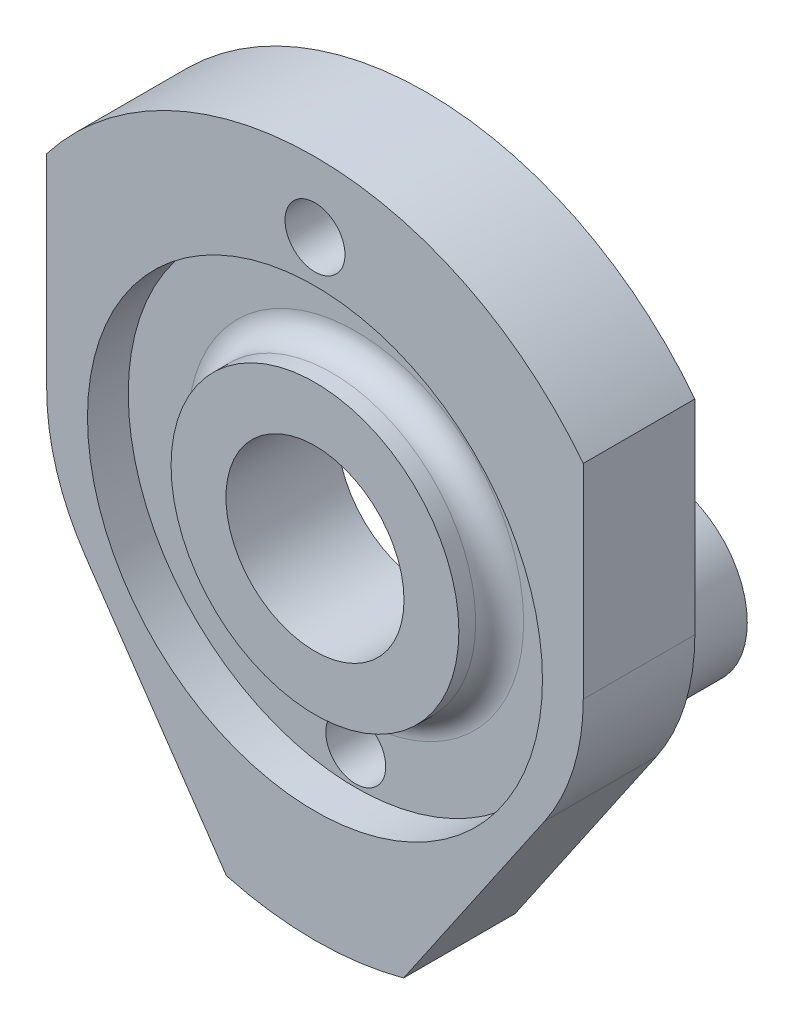
ISO-10303-21;
HEADER;
FILE_DESCRIPTION(('STEP AP214'),'2;1');
FILE_NAME('part.step','',(''),(''),'','','');
FILE_SCHEMA(('AUTOMOTIVE_DESIGN { 1 0 10303 214 1 1 1 1 }'));
ENDSEC;
DATA;
#1=APPLICATION_CONTEXT('core data for automotive mechanical design processes');
#2=APPLICATION_PROTOCOL_DEFINITION('international standard','automotive_design',2000,#1);
#3=PRODUCT_CONTEXT('',#1,'mechanical');
#4=PRODUCT('Part','Part','',(#3));
#5=PRODUCT_RELATED_PRODUCT_CATEGORY('part','',(#4));
#6=PRODUCT_DEFINITION_FORMATION('','',#4);
#7=PRODUCT_DEFINITION_CONTEXT('part definition',#1,'design');
#8=PRODUCT_DEFINITION('design','',#6,#7);
#9=PRODUCT_DEFINITION_SHAPE('','',#8);
#10=(LENGTH_UNIT() NAMED_UNIT(*) SI_UNIT(.MILLI.,.METRE.));
#11=(NAMED_UNIT(*) PLANE_ANGLE_UNIT() SI_UNIT($,.RADIAN.));
#12=(NAMED_UNIT(*) SI_UNIT($,.STERADIAN.) SOLID_ANGLE_UNIT());
#13=UNCERTAINTY_MEASURE_WITH_UNIT(LENGTH_MEASURE(1.E-05),#10,'distance_accuracy_value','');
#14=(GEOMETRIC_REPRESENTATION_CONTEXT(3) GLOBAL_UNCERTAINTY_ASSIGNED_CONTEXT((#13)) GLOBAL_UNIT_ASSIGNED_CONTEXT((#10,
#11,#12)) REPRESENTATION_CONTEXT('',''));
#15=CARTESIAN_POINT('',(0.,0.,0.));
#16=DIRECTION('',(0.,0.,1.));
#17=DIRECTION('',(1.,0.,0.));
#18=AXIS2_PLACEMENT_3D('',#15,#16,#17);
#19=CARTESIAN_POINT('',(0.,0.,0.));
#20=DIRECTION('',(0.,0.,1.));
#21=DIRECTION('',(1.,0.,0.));
#22=AXIS2_PLACEMENT_3D('',#19,#20,#21);
#23=PLANE('',#22);
#24=CARTESIAN_POINT('',(0.,0.,0.));
#25=DIRECTION('',(0.,0.,1.));
#26=DIRECTION('',(1.,0.,0.));
#27=AXIS2_PLACEMENT_3D('',#24,#25,#26);
#28=CIRCLE('',#27,14.85);
#29=CARTESIAN_POINT('',(14.85,0.,0.));
#30=VERTEX_POINT('',#29);
#31=EDGE_CURVE('E275',#30,#30,#28,.T.);
#32=ORIENTED_EDGE('',*,*,#31,.F.);
#33=EDGE_LOOP('',(#32));
#34=FACE_BOUND('',#33,.T.);
#35=CARTESIAN_POINT('',(0.,0.,0.));
#36=DIRECTION('',(0.,0.,1.));
#37=DIRECTION('',(1.,0.,0.));
#38=AXIS2_PLACEMENT_3D('',#35,#36,#37);
#39=CIRCLE('',#38,24.);
#40=CARTESIAN_POINT('',(24.,0.,0.));
#41=VERTEX_POINT('',#40);
#42=EDGE_CURVE('E212',#41,#41,#39,.T.);
#43=ORIENTED_EDGE('',*,*,#42,.T.);
#44=EDGE_LOOP('',(#43));
#45=FACE_BOUND('',#44,.T.);
#46=ADVANCED_FACE('F50',(#34,#45),#23,.T.);
#47=CARTESIAN_POINT('',(0.,0.,-18.61));
#48=DIRECTION('',(0.,0.,1.));
#49=DIRECTION('',(1.,0.,0.));
#50=AXIS2_PLACEMENT_3D('',#47,#48,#49);
#51=CYLINDRICAL_SURFACE('',#50,56.6);
#52=CARTESIAN_POINT('',(0.,0.,0.));
#53=DIRECTION('',(0.,0.,1.));
#54=DIRECTION('',(1.,0.,0.));
#55=AXIS2_PLACEMENT_3D('',#52,#53,#54);
#56=CIRCLE('',#55,56.6);
#57=CARTESIAN_POINT('',(-14.781228099979,-54.6358425930853,0.));
#58=VERTEX_POINT('',#57);
#59=CARTESIAN_POINT('',(14.7812280999789,-54.6358425930853,0.));
#60=VERTEX_POINT('',#59);
#61=EDGE_CURVE('E179',#58,#60,#56,.T.);
#62=ORIENTED_EDGE('',*,*,#61,.F.);
#63=DIRECTION('',(0.,0.,1.));
#64=VECTOR('',#63,1.);
#65=CARTESIAN_POINT('',(-14.781228099979,-54.6358425930853,-18.61));
#66=LINE('',#65,#64);
#67=CARTESIAN_POINT('',(-14.781228099979,-54.6358425930853,-18.61));
#68=VERTEX_POINT('',#67);
#69=EDGE_CURVE('E156',#68,#58,#66,.T.);
#70=ORIENTED_EDGE('',*,*,#69,.F.);
#71=CARTESIAN_POINT('',(0.,0.,-18.61));
#72=DIRECTION('',(0.,0.,1.));
#73=DIRECTION('',(1.,0.,0.));
#74=AXIS2_PLACEMENT_3D('',#71,#72,#73);
#75=CIRCLE('',#74,56.6);
#76=CARTESIAN_POINT('',(14.7812280999789,-54.6358425930853,-18.61));
#77=VERTEX_POINT('',#76);
#78=EDGE_CURVE('E149',#68,#77,#75,.T.);
#79=ORIENTED_EDGE('',*,*,#78,.T.);
#80=DIRECTION('',(0.,0.,1.));
#81=VECTOR('',#80,1.);
#82=CARTESIAN_POINT('',(14.7812280999789,-54.6358425930853,-18.61));
#83=LINE('',#82,#81);
#84=EDGE_CURVE('E134',#77,#60,#83,.T.);
#85=ORIENTED_EDGE('',*,*,#84,.T.);
#86=EDGE_LOOP('',(#62,#70,#79,#85));
#87=FACE_BOUND('',#86,.T.);
#88=ADVANCED_FACE('F154',(#87),#51,.T.);
#89=CARTESIAN_POINT('',(-14.781228099979,-54.6358425930853,-18.61));
#90=DIRECTION('',(-0.825585630046645,-0.564276853557263,0.));
#91=DIRECTION('',(0.564276853557263,-0.825585630046645,0.));
#92=AXIS2_PLACEMENT_3D('',#89,#90,#91);
#93=PLANE('',#92);
#94=DIRECTION('',(0.564276853557263,-0.825585630046644,0.));
#95=VECTOR('',#94,1.);
#96=CARTESIAN_POINT('',(-14.781228099979,-54.6358425930853,0.));
#97=LINE('',#96,#95);
#98=CARTESIAN_POINT('',(-38.2990411154172,-20.2272568903946,0.));
#99=VERTEX_POINT('',#98);
#100=EDGE_CURVE('E160',#99,#58,#97,.T.);
#101=ORIENTED_EDGE('',*,*,#100,.F.);
#102=DIRECTION('',(0.,0.,1.));
#103=VECTOR('',#102,1.);
#104=CARTESIAN_POINT('',(-38.2990411154172,-20.2272568903946,-18.61));
#105=LINE('',#104,#103);
#106=CARTESIAN_POINT('',(-38.2990411154172,-20.2272568903946,-18.61));
#107=VERTEX_POINT('',#106);
#108=EDGE_CURVE('E199',#107,#99,#105,.T.);
#109=ORIENTED_EDGE('',*,*,#108,.F.);
#110=DIRECTION('',(0.564276853557263,-0.825585630046644,0.));
#111=VECTOR('',#110,1.);
#112=CARTESIAN_POINT('',(-14.781228099979,-54.6358425930853,-18.61));
#113=LINE('',#112,#111);
#114=EDGE_CURVE('E142',#107,#68,#113,.T.);
#115=ORIENTED_EDGE('',*,*,#114,.T.);
#116=ORIENTED_EDGE('',*,*,#69,.T.);
#117=EDGE_LOOP('',(#101,#109,#115,#116));
#118=FACE_BOUND('',#117,.T.);
#119=ADVANCED_FACE('F294',(#118),#93,.T.);
#120=CARTESIAN_POINT('',(-7.81093913015704,0.610957382065083,-18.61));
#121=DIRECTION('',(0.,0.,1.));
#122=DIRECTION('',(1.,0.,0.));
#123=AXIS2_PLACEMENT_3D('',#120,#121,#122);
#124=CYLINDRICAL_SURFACE('',#123,36.929060869843);
#125=CARTESIAN_POINT('',(-7.81093913015704,0.610957382065083,0.));
#126=DIRECTION('',(0.,0.,1.));
#127=DIRECTION('',(1.,0.,0.));
#128=AXIS2_PLACEMENT_3D('',#125,#126,#127);
#129=CIRCLE('',#128,36.929060869843);
#130=CARTESIAN_POINT('',(-44.74,0.610957382065083,0.));
#131=VERTEX_POINT('',#130);
#132=EDGE_CURVE('E159',#131,#99,#129,.T.);
#133=ORIENTED_EDGE('',*,*,#132,.F.);
#134=DIRECTION('',(0.,0.,1.));
#135=VECTOR('',#134,1.);
#136=CARTESIAN_POINT('',(-44.74,0.610957382065083,-18.61));
#137=LINE('',#136,#135);
#138=CARTESIAN_POINT('',(-44.74,0.610957382065083,-18.61));
#139=VERTEX_POINT('',#138);
#140=EDGE_CURVE('E205',#139,#131,#137,.T.);
#141=ORIENTED_EDGE('',*,*,#140,.F.);
#142=CARTESIAN_POINT('',(-7.81093913015704,0.610957382065083,-18.61));
#143=DIRECTION('',(0.,0.,1.));
#144=DIRECTION('',(1.,0.,0.));
#145=AXIS2_PLACEMENT_3D('',#142,#143,#144);
#146=CIRCLE('',#145,36.929060869843);
#147=EDGE_CURVE('E178',#139,#107,#146,.T.);
#148=ORIENTED_EDGE('',*,*,#147,.T.);
#149=ORIENTED_EDGE('',*,*,#108,.T.);
#150=EDGE_LOOP('',(#133,#141,#148,#149));
#151=FACE_BOUND('',#150,.T.);
#152=ADVANCED_FACE('F332',(#151),#124,.T.);
#153=CARTESIAN_POINT('',(-44.74,0.610957382065083,-18.61));
#154=DIRECTION('',(-1.,0.,0.));
#155=DIRECTION('',(0.,0.,1.));
#156=AXIS2_PLACEMENT_3D('',#153,#154,#155);
#157=PLANE('',#156);
#158=DIRECTION('',(0.,-1.,0.));
#159=VECTOR('',#158,1.);
#160=CARTESIAN_POINT('',(-44.74,0.610957382065083,0.));
#161=LINE('',#160,#159);
#162=CARTESIAN_POINT('',(-44.74,34.6683198323772,0.));
#163=VERTEX_POINT('',#162);
#164=EDGE_CURVE('E191',#163,#131,#161,.T.);
#165=ORIENTED_EDGE('',*,*,#164,.F.);
#166=DIRECTION('',(0.,0.,1.));
#167=VECTOR('',#166,1.);
#168=CARTESIAN_POINT('',(-44.74,34.6683198323772,-18.61));
#169=LINE('',#168,#167);
#170=CARTESIAN_POINT('',(-44.74,34.6683198323772,-18.61));
#171=VERTEX_POINT('',#170);
#172=EDGE_CURVE('E204',#171,#163,#169,.T.);
#173=ORIENTED_EDGE('',*,*,#172,.F.);
#174=DIRECTION('',(0.,-1.,0.));
#175=VECTOR('',#174,1.);
#176=CARTESIAN_POINT('',(-44.74,0.610957382065083,-18.61));
#177=LINE('',#176,#175);
#178=EDGE_CURVE('E175',#171,#139,#177,.T.);
#179=ORIENTED_EDGE('',*,*,#178,.T.);
#180=ORIENTED_EDGE('',*,*,#140,.T.);
#181=EDGE_LOOP('',(#165,#173,#179,#180));
#182=FACE_BOUND('',#181,.T.);
#183=ADVANCED_FACE('F303',(#182),#157,.T.);
#184=CARTESIAN_POINT('',(0.,0.,-18.61));
#185=DIRECTION('',(0.,0.,1.));
#186=DIRECTION('',(1.,0.,0.));
#187=AXIS2_PLACEMENT_3D('',#184,#185,#186);
#188=CYLINDRICAL_SURFACE('',#187,56.6);
#189=CARTESIAN_POINT('',(0.,0.,0.));
#190=DIRECTION('',(0.,0.,1.));
#191=DIRECTION('',(1.,0.,0.));
#192=AXIS2_PLACEMENT_3D('',#189,#190,#191);
#193=CIRCLE('',#192,56.6);
#194=CARTESIAN_POINT('',(44.7443507368182,34.6627044118113,0.));
#195=VERTEX_POINT('',#194);
#196=EDGE_CURVE('E187',#195,#163,#193,.T.);
#197=ORIENTED_EDGE('',*,*,#196,.F.);
#198=DIRECTION('',(0.,0.,1.));
#199=VECTOR('',#198,1.);
#200=CARTESIAN_POINT('',(44.7443507368182,34.6627044118113,-18.61));
#201=LINE('',#200,#199);
#202=CARTESIAN_POINT('',(44.7443507368182,34.6627044118113,-18.61));
#203=VERTEX_POINT('',#202);
#204=EDGE_CURVE('E206',#203,#195,#201,.T.);
#205=ORIENTED_EDGE('',*,*,#204,.F.);
#206=CARTESIAN_POINT('',(0.,0.,-18.61));
#207=DIRECTION('',(0.,0.,1.));
#208=DIRECTION('',(1.,0.,0.));
#209=AXIS2_PLACEMENT_3D('',#206,#207,#208);
#210=CIRCLE('',#209,56.6);
#211=EDGE_CURVE('E168',#203,#171,#210,.T.);
#212=ORIENTED_EDGE('',*,*,#211,.T.);
#213=ORIENTED_EDGE('',*,*,#172,.T.);
#214=EDGE_LOOP('',(#197,#205,#212,#213));
#215=FACE_BOUND('',#214,.T.);
#216=ADVANCED_FACE('F302',(#215),#188,.T.);
#217=CARTESIAN_POINT('',(44.7443507368182,34.6627044118113,-18.61));
#218=DIRECTION('',(1.,0.,0.));
#219=DIRECTION('',(0.,0.,-1.));
#220=AXIS2_PLACEMENT_3D('',#217,#218,#219);
#221=PLANE('',#220);
#222=DIRECTION('',(0.,1.,0.));
#223=VECTOR('',#222,1.);
#224=CARTESIAN_POINT('',(44.7443507368182,34.6627044118113,0.));
#225=LINE('',#224,#223);
#226=CARTESIAN_POINT('',(44.7443507368182,0.617322884698073,0.));
#227=VERTEX_POINT('',#226);
#228=EDGE_CURVE('E186',#227,#195,#225,.T.);
#229=ORIENTED_EDGE('',*,*,#228,.F.);
#230=DIRECTION('',(0.,0.,1.));
#231=VECTOR('',#230,1.);
#232=CARTESIAN_POINT('',(44.7443507368182,0.617322884698073,-18.61));
#233=LINE('',#232,#231);
#234=CARTESIAN_POINT('',(44.7443507368182,0.617322884698073,-18.61));
#235=VERTEX_POINT('',#234);
#236=EDGE_CURVE('E208',#235,#227,#233,.T.);
#237=ORIENTED_EDGE('',*,*,#236,.F.);
#238=DIRECTION('',(0.,1.,0.));
#239=VECTOR('',#238,1.);
#240=CARTESIAN_POINT('',(44.7443507368182,34.6627044118113,-18.61));
#241=LINE('',#240,#239);
#242=EDGE_CURVE('E170',#235,#203,#241,.T.);
#243=ORIENTED_EDGE('',*,*,#242,.T.);
#244=ORIENTED_EDGE('',*,*,#204,.T.);
#245=EDGE_LOOP('',(#229,#237,#243,#244));
#246=FACE_BOUND('',#245,.T.);
#247=ADVANCED_FACE('F307',(#246),#221,.T.);
#248=CARTESIAN_POINT('',(7.81528986697513,0.617322884698068,-18.61));
#249=DIRECTION('',(0.,0.,1.));
#250=DIRECTION('',(1.,0.,0.));
#251=AXIS2_PLACEMENT_3D('',#248,#249,#250);
#252=CYLINDRICAL_SURFACE('',#251,36.9290608698431);
#253=CARTESIAN_POINT('',(7.81528986697513,0.617322884698068,0.));
#254=DIRECTION('',(0.,0.,1.));
#255=DIRECTION('',(-1.,0.,0.));
#256=AXIS2_PLACEMENT_3D('',#253,#254,#255);
#257=CIRCLE('',#256,36.9290608698431);
#258=CARTESIAN_POINT('',(38.3033918522353,-20.2208913877618,0.));
#259=VERTEX_POINT('',#258);
#260=EDGE_CURVE('E184',#259,#227,#257,.T.);
#261=ORIENTED_EDGE('',*,*,#260,.F.);
#262=DIRECTION('',(0.,0.,1.));
#263=VECTOR('',#262,1.);
#264=CARTESIAN_POINT('',(38.3033918522353,-20.2208913877618,-18.61));
#265=LINE('',#264,#263);
#266=CARTESIAN_POINT('',(38.3033918522353,-20.2208913877618,-18.61));
#267=VERTEX_POINT('',#266);
#268=EDGE_CURVE('E143',#267,#259,#265,.T.);
#269=ORIENTED_EDGE('',*,*,#268,.F.);
#270=CARTESIAN_POINT('',(7.81528986697513,0.617322884698068,-18.61));
#271=DIRECTION('',(0.,0.,1.));
#272=DIRECTION('',(-1.,0.,0.));
#273=AXIS2_PLACEMENT_3D('',#270,#271,#272);
#274=CIRCLE('',#273,36.9290608698431);
#275=EDGE_CURVE('E153',#267,#235,#274,.T.);
#276=ORIENTED_EDGE('',*,*,#275,.T.);
#277=ORIENTED_EDGE('',*,*,#236,.T.);
#278=EDGE_LOOP('',(#261,#269,#276,#277));
#279=FACE_BOUND('',#278,.T.);
#280=ADVANCED_FACE('F309',(#279),#252,.T.);
#281=CARTESIAN_POINT('',(14.7812280999789,-54.6358425930853,-18.61));
#282=DIRECTION('',(0.825585630046642,-0.564276853557267,0.));
#283=DIRECTION('',(0.564276853557267,0.825585630046642,0.));
#284=AXIS2_PLACEMENT_3D('',#281,#282,#283);
#285=PLANE('',#284);
#286=DIRECTION('',(0.564276853557267,0.825585630046642,0.));
#287=VECTOR('',#286,1.);
#288=CARTESIAN_POINT('',(14.7812280999789,-54.6358425930853,0.));
#289=LINE('',#288,#287);
#290=EDGE_CURVE('E138',#60,#259,#289,.T.);
#291=ORIENTED_EDGE('',*,*,#290,.F.);
#292=ORIENTED_EDGE('',*,*,#84,.F.);
#293=DIRECTION('',(0.564276853557267,0.825585630046642,0.));
#294=VECTOR('',#293,1.);
#295=CARTESIAN_POINT('',(14.7812280999789,-54.6358425930853,-18.61));
#296=LINE('',#295,#294);
#297=EDGE_CURVE('E133',#77,#267,#296,.T.);
#298=ORIENTED_EDGE('',*,*,#297,.T.);
#299=ORIENTED_EDGE('',*,*,#268,.T.);
#300=EDGE_LOOP('',(#291,#292,#298,#299));
#301=FACE_BOUND('',#300,.T.);
#302=ADVANCED_FACE('F135',(#301),#285,.T.);
#303=CARTESIAN_POINT('',(0.,0.,-18.61));
#304=DIRECTION('',(0.,0.,1.));
#305=DIRECTION('',(1.,0.,0.));
#306=AXIS2_PLACEMENT_3D('',#303,#304,#305);
#307=PLANE('',#306);
#308=CARTESIAN_POINT('',(0.,-32.4,-18.61));
#309=DIRECTION('',(0.,0.,1.));
#310=DIRECTION('',(1.,0.,0.));
#311=AXIS2_PLACEMENT_3D('',#308,#309,#310);
#312=CIRCLE('',#311,14.35);
#313=CARTESIAN_POINT('',(14.35,-32.4,-18.61));
#314=VERTEX_POINT('',#313);
#315=EDGE_CURVE('E211',#314,#314,#312,.T.);
#316=ORIENTED_EDGE('',*,*,#315,.T.);
#317=EDGE_LOOP('',(#316));
#318=FACE_BOUND('',#317,.T.);
#319=CARTESIAN_POINT('',(0.,0.,-18.61));
#320=DIRECTION('',(0.,0.,1.));
#321=DIRECTION('',(1.,0.,0.));
#322=AXIS2_PLACEMENT_3D('',#319,#320,#321);
#323=CIRCLE('',#322,14.85);
#324=CARTESIAN_POINT('',(14.85,0.,-18.61));
#325=VERTEX_POINT('',#324);
#326=EDGE_CURVE('E273',#325,#325,#323,.T.);
#327=ORIENTED_EDGE('',*,*,#326,.T.);
#328=EDGE_LOOP('',(#327));
#329=FACE_BOUND('',#328,.T.);
#330=CARTESIAN_POINT('',(0.,44.95,-18.61));
#331=DIRECTION('',(0.,0.,1.));
#332=DIRECTION('',(1.,0.,0.));
#333=AXIS2_PLACEMENT_3D('',#330,#331,#332);
#334=CIRCLE('',#333,4.99999999999998);
#335=CARTESIAN_POINT('',(4.99999999999998,44.95,-18.61));
#336=VERTEX_POINT('',#335);
#337=EDGE_CURVE('E185',#336,#336,#334,.T.);
#338=ORIENTED_EDGE('',*,*,#337,.T.);
#339=EDGE_LOOP('',(#338));
#340=FACE_BOUND('',#339,.T.);
#341=ORIENTED_EDGE('',*,*,#78,.F.);
#342=ORIENTED_EDGE('',*,*,#114,.F.);
#343=ORIENTED_EDGE('',*,*,#147,.F.);
#344=ORIENTED_EDGE('',*,*,#178,.F.);
#345=ORIENTED_EDGE('',*,*,#211,.F.);
#346=ORIENTED_EDGE('',*,*,#242,.F.);
#347=ORIENTED_EDGE('',*,*,#275,.F.);
#348=ORIENTED_EDGE('',*,*,#297,.F.);
#349=EDGE_LOOP('',(#341,#342,#343,#344,#345,#346,#347,#348));
#350=FACE_BOUND('',#349,.T.);
#351=ADVANCED_FACE('F150',(#318,#329,#340,#350),#307,.F.);
#352=CARTESIAN_POINT('',(0.,0.,0.));
#353=DIRECTION('',(0.,0.,1.));
#354=DIRECTION('',(1.,0.,0.));
#355=AXIS2_PLACEMENT_3D('',#352,#353,#354);
#356=CIRCLE('',#355,37.94);
#357=CARTESIAN_POINT('',(37.94,0.,0.));
#358=VERTEX_POINT('',#357);
#359=EDGE_CURVE('E263',#358,#358,#356,.T.);
#360=ORIENTED_EDGE('',*,*,#359,.F.);
#361=EDGE_LOOP('',(#360));
#362=FACE_BOUND('',#361,.T.);
#363=CARTESIAN_POINT('',(0.,44.95,0.));
#364=DIRECTION('',(0.,0.,1.));
#365=DIRECTION('',(1.,0.,0.));
#366=AXIS2_PLACEMENT_3D('',#363,#364,#365);
#367=CIRCLE('',#366,4.99999999999998);
#368=CARTESIAN_POINT('',(4.99999999999998,44.95,0.));
#369=VERTEX_POINT('',#368);
#370=EDGE_CURVE('E162',#369,#369,#367,.T.);
#371=ORIENTED_EDGE('',*,*,#370,.F.);
#372=EDGE_LOOP('',(#371));
#373=FACE_BOUND('',#372,.T.);
#374=ORIENTED_EDGE('',*,*,#61,.T.);
#375=ORIENTED_EDGE('',*,*,#290,.T.);
#376=ORIENTED_EDGE('',*,*,#260,.T.);
#377=ORIENTED_EDGE('',*,*,#228,.T.);
#378=ORIENTED_EDGE('',*,*,#196,.T.);
#379=ORIENTED_EDGE('',*,*,#164,.T.);
#380=ORIENTED_EDGE('',*,*,#132,.T.);
#381=ORIENTED_EDGE('',*,*,#100,.T.);
#382=EDGE_LOOP('',(#374,#375,#376,#377,#378,#379,#380,#381));
#383=FACE_BOUND('',#382,.T.);
#384=ADVANCED_FACE('F288',(#362,#373,#383),#23,.T.);
#385=CARTESIAN_POINT('',(0.,44.95,-18.61));
#386=DIRECTION('',(0.,0.,1.));
#387=DIRECTION('',(1.,0.,0.));
#388=AXIS2_PLACEMENT_3D('',#385,#386,#387);
#389=CYLINDRICAL_SURFACE('',#388,4.99999999999998);
#390=ORIENTED_EDGE('',*,*,#337,.F.);
#391=EDGE_LOOP('',(#390));
#392=FACE_BOUND('',#391,.T.);
#393=ORIENTED_EDGE('',*,*,#370,.T.);
#394=EDGE_LOOP('',(#393));
#395=FACE_BOUND('',#394,.T.);
#396=ADVANCED_FACE('F283',(#392,#395),#389,.F.);
#397=CARTESIAN_POINT('',(0.,0.,-18.61));
#398=DIRECTION('',(0.,0.,1.));
#399=DIRECTION('',(1.,0.,0.));
#400=AXIS2_PLACEMENT_3D('',#397,#398,#399);
#401=CYLINDRICAL_SURFACE('',#400,14.85);
#402=ORIENTED_EDGE('',*,*,#326,.F.);
#403=EDGE_LOOP('',(#402));
#404=FACE_BOUND('',#403,.T.);
#405=ORIENTED_EDGE('',*,*,#31,.T.);
#406=EDGE_LOOP('',(#405));
#407=FACE_BOUND('',#406,.T.);
#408=ADVANCED_FACE('F372',(#404,#407),#401,.F.);
#409=CARTESIAN_POINT('',(0.,0.,-6.8));
#410=DIRECTION('',(0.,0.,1.));
#411=DIRECTION('',(1.,0.,0.));
#412=AXIS2_PLACEMENT_3D('',#409,#410,#411);
#413=CYLINDRICAL_SURFACE('',#412,37.94);
#414=CARTESIAN_POINT('',(0.,0.,-6.8));
#415=DIRECTION('',(0.,0.,1.));
#416=DIRECTION('',(1.,0.,0.));
#417=AXIS2_PLACEMENT_3D('',#414,#415,#416);
#418=CIRCLE('',#417,37.94);
#419=CARTESIAN_POINT('',(37.94,0.,-6.8));
#420=VERTEX_POINT('',#419);
#421=EDGE_CURVE('E266',#420,#420,#418,.T.);
#422=ORIENTED_EDGE('',*,*,#421,.F.);
#423=EDGE_LOOP('',(#422));
#424=FACE_BOUND('',#423,.T.);
#425=ORIENTED_EDGE('',*,*,#359,.T.);
#426=EDGE_LOOP('',(#425));
#427=FACE_BOUND('',#426,.T.);
#428=ADVANCED_FACE('F381',(#424,#427),#413,.F.);
#429=CARTESIAN_POINT('',(0.,0.,-6.8));
#430=DIRECTION('',(0.,0.,1.));
#431=DIRECTION('',(1.,0.,0.));
#432=AXIS2_PLACEMENT_3D('',#429,#430,#431);
#433=PLANE('',#432);
#434=CARTESIAN_POINT('',(0.,-32.4,-6.8));
#435=DIRECTION('',(0.,0.,1.));
#436=DIRECTION('',(1.,0.,0.));
#437=AXIS2_PLACEMENT_3D('',#434,#435,#436);
#438=CIRCLE('',#437,5.);
#439=CARTESIAN_POINT('',(-2.20601419493573,-27.912962962963,-6.8));
#440=VERTEX_POINT('',#439);
#441=CARTESIAN_POINT('',(2.20601419493573,-27.912962962963,-6.8));
#442=VERTEX_POINT('',#441);
#443=EDGE_CURVE('E252',#440,#442,#438,.T.);
#444=ORIENTED_EDGE('',*,*,#443,.F.);
#445=CARTESIAN_POINT('',(0.,0.,-6.8));
#446=DIRECTION('',(0.,0.,1.));
#447=DIRECTION('',(1.,0.,0.));
#448=AXIS2_PLACEMENT_3D('',#445,#446,#447);
#449=CIRCLE('',#448,28.);
#450=EDGE_CURVE('E11',#440,#442,#449,.F.);
#451=ORIENTED_EDGE('',*,*,#450,.T.);
#452=EDGE_LOOP('',(#444,#451));
#453=FACE_BOUND('',#452,.T.);
#454=ORIENTED_EDGE('',*,*,#421,.T.);
#455=EDGE_LOOP('',(#454));
#456=FACE_BOUND('',#455,.T.);
#457=ADVANCED_FACE('F232',(#453,#456),#433,.T.);
#458=CARTESIAN_POINT('',(0.,0.,-6.8));
#459=DIRECTION('',(0.,0.,1.));
#460=DIRECTION('',(1.,0.,0.));
#461=AXIS2_PLACEMENT_3D('',#458,#459,#460);
#462=CYLINDRICAL_SURFACE('',#461,24.);
#463=CARTESIAN_POINT('',(0.,0.,-2.8));
#464=DIRECTION('',(0.,0.,1.));
#465=DIRECTION('',(1.,0.,0.));
#466=AXIS2_PLACEMENT_3D('',#463,#464,#465);
#467=CIRCLE('',#466,24.);
#468=CARTESIAN_POINT('',(1.89086930994491,-23.9253968253968,-2.8));
#469=VERTEX_POINT('',#468);
#470=CARTESIAN_POINT('',(-1.89086930994491,-23.9253968253968,-2.8));
#471=VERTEX_POINT('',#470);
#472=EDGE_CURVE('E200',#469,#471,#467,.T.);
#473=ORIENTED_EDGE('',*,*,#472,.T.);
#474=CARTESIAN_POINT('',(3.37495951961844,-28.7108743256787,-6.8));
#475=CARTESIAN_POINT('',(2.30597018683278,-23.9314902239368,-7.86579287941891));
#476=CARTESIAN_POINT('',(3.71486951926954,-23.7107516636399,-3.06085352428966));
#477=CARTESIAN_POINT('',(3.34407138181493,-28.6826254638199,-6.8));
#478=CARTESIAN_POINT('',(2.32513876520219,-23.9240633651593,-7.82806766510209));
#479=CARTESIAN_POINT('',(3.64196926867418,-23.7221743340385,-3.03529902350393));
#480=CARTESIAN_POINT('',(3.31145259169797,-28.6534871617223,-6.8));
#481=CARTESIAN_POINT('',(2.34038405056154,-23.9177400147507,-7.78790325578486));
#482=CARTESIAN_POINT('',(3.56847382331042,-23.7333435495826,-3.01198916355505));
#483=CARTESIAN_POINT('',(3.24242432521381,-28.593586428828,-6.8));
#484=CARTESIAN_POINT('',(2.36205945008388,-23.9072758949098,-7.70412562716869));
#485=CARTESIAN_POINT('',(3.4205446445296,-23.755114215084,-2.96959870613814));
#486=CARTESIAN_POINT('',(3.20601665362864,-28.5628247747037,-6.8));
#487=CARTESIAN_POINT('',(2.36857357487655,-23.9031158825439,-7.66057346613757));
#488=CARTESIAN_POINT('',(3.34611137254995,-23.7657159317502,-2.95051610850138));
#489=CARTESIAN_POINT('',(3.09090838328983,-28.4685717622608,-6.8));
#490=CARTESIAN_POINT('',(2.37402109028384,-23.8937727742728,-7.52747462368344));
#491=CARTESIAN_POINT('',(3.12233466474711,-23.7965042037602,-2.89933679188749));
#492=CARTESIAN_POINT('',(3.00605740222484,-28.4028619679542,-6.8));
#493=CARTESIAN_POINT('',(2.35965859263626,-23.8914532468395,-7.43404891382282));
#494=CARTESIAN_POINT('',(2.97187086798918,-23.8157750546488,-2.87308923823231));
#495=CARTESIAN_POINT('',(2.81710902634621,-28.26751733041,-6.8));
#496=CARTESIAN_POINT('',(2.2918987050213,-23.8930896876243,-7.24689621555437));
#497=CARTESIAN_POINT('',(2.66926670278382,-23.8515886967599,-2.83356764626773));
#498=CARTESIAN_POINT('',(2.71298767832668,-28.1978776780465,-6.8));
#499=CARTESIAN_POINT('',(2.23930825831868,-23.8969205542876,-7.15326875409773));
#500=CARTESIAN_POINT('',(2.51712447182464,-23.8681280437469,-2.82030988488677));
#501=CARTESIAN_POINT('',(2.54054827226386,-28.0930144431887,-6.8));
#502=CARTESIAN_POINT('',(2.13201949001382,-23.9056240545098,-7.01793114697298));
#503=CARTESIAN_POINT('',(2.28833949446675,-23.8907805436789,-2.80780029407252));
#504=CARTESIAN_POINT('',(2.48030852719495,-28.0579667730038,-6.8));
#505=CARTESIAN_POINT('',(2.09191137399584,-23.9089834360336,-6.97396372041484));
#506=CARTESIAN_POINT('',(2.21192606495804,-23.8979764609177,-2.80486049857302));
#507=CARTESIAN_POINT('',(2.35420179919645,-27.9883191635975,-6.8));
#508=CARTESIAN_POINT('',(2.0030184865636,-23.9163555745863,-6.88877105363745));
#509=CARTESIAN_POINT('',(2.05899739071652,-23.9116377692336,-2.80101748731584));
#510=CARTESIAN_POINT('',(2.28833495410506,-27.9537192134328,-6.8));
#511=CARTESIAN_POINT('',(1.95431305102504,-23.9203624308227,-6.84750847829694));
#512=CARTESIAN_POINT('',(1.98248214852283,-23.9181031781959,-2.80011422168733));
#513=CARTESIAN_POINT('',(2.14436572474246,-27.8823967944452,-6.8));
#514=CARTESIAN_POINT('',(1.84390368857481,-23.9291267771479,-6.76472547960624));
#515=CARTESIAN_POINT('',(1.8221905678848,-23.9308729648825,-2.79989637945532));
#516=CARTESIAN_POINT('',(2.06569521713271,-27.8457810404951,-6.8));
#517=CARTESIAN_POINT('',(1.78142416943195,-23.9339215621528,-6.72344253220382));
#518=CARTESIAN_POINT('',(1.73840859864986,-23.9371049182878,-2.8007393239355));
#519=CARTESIAN_POINT('',(1.90144309082201,-27.7747955764499,-6.8));
#520=CARTESIAN_POINT('',(1.64772329957037,-23.9435804638722,-6.64570720071337));
#521=CARTESIAN_POINT('',(1.57080079234492,-23.9486876845977,-2.80375725092343));
#522=CARTESIAN_POINT('',(1.81586124575847,-27.7404259399874,-6.8));
#523=CARTESIAN_POINT('',(1.57653959807603,-23.9484474226375,-6.6091786340427));
#524=CARTESIAN_POINT('',(1.4869749539275,-23.9540384686245,-2.80593227707537));
#525=CARTESIAN_POINT('',(1.63799500438643,-27.6749655438394,-6.8));
#526=CARTESIAN_POINT('',(1.4264956544811,-23.9579231440662,-6.54150535623077));
#527=CARTESIAN_POINT('',(1.31927011316937,-23.9638599475612,-2.81104283153864));
#528=CARTESIAN_POINT('',(1.54570902712185,-27.6438755618223,-6.8));
#529=CARTESIAN_POINT('',(1.34762795023276,-23.9625388495763,-6.51028022801005));
#530=CARTESIAN_POINT('',(1.23539110294275,-23.9683304339526,-2.81397853965429));
#531=CARTESIAN_POINT('',(1.35496967540431,-27.5860636721774,-6.8));
#532=CARTESIAN_POINT('',(1.18343608940278,-23.9712233093482,-6.45363951547517));
#533=CARTESIAN_POINT('',(1.06759873746644,-23.9763902117553,-2.82006648787335));
#534=CARTESIAN_POINT('',(1.25651643974272,-27.5593416662992,-6.8));
#535=CARTESIAN_POINT('',(1.09806042470245,-23.9753016805967,-6.42814381267817));
#536=CARTESIAN_POINT('',(0.98368538303184,-23.9799795229881,-2.82321872310408));
#537=CARTESIAN_POINT('',(1.05433916869768,-27.5113240108235,-6.8));
#538=CARTESIAN_POINT('',(0.922216050867893,-23.9826698816352,-6.38326487637627));
#539=CARTESIAN_POINT('',(0.815865648678944,-23.9862754495093,-2.82924827448715));
#540=CARTESIAN_POINT('',(0.950618154325754,-27.4900252922545,-6.8));
#541=CARTESIAN_POINT('',(0.831653819541769,-23.9859705183528,-6.36380681617775));
#542=CARTESIAN_POINT('',(0.731959291796699,-23.9889825642656,-2.83212574554637));
#543=CARTESIAN_POINT('',(0.739026390179723,-27.4537532556249,-6.8));
#544=CARTESIAN_POINT('',(0.6468040483412,-23.9916003747006,-6.33117289708672));
#545=CARTESIAN_POINT('',(0.564107149728806,-23.9935164513041,-2.83720084195202));
#546=CARTESIAN_POINT('',(0.631155648834344,-27.4387799247174,-6.8));
#547=CARTESIAN_POINT('',(0.552379869781273,-23.99393886463,-6.31794023510894));
#548=CARTESIAN_POINT('',(0.480161364623584,-23.9953432253743,-2.83939846867924));
#549=CARTESIAN_POINT('',(0.412759213784465,-27.4158572482108,-6.8));
#550=CARTESIAN_POINT('',(0.361319274139704,-23.9975166859405,-6.29786643484445));
#551=CARTESIAN_POINT('',(0.312261144313037,-23.9981153556432,-2.84281735931324));
#552=CARTESIAN_POINT('',(0.302234196185389,-27.4079061329817,-6.8));
#553=CARTESIAN_POINT('',(0.264516648914696,-23.9987627792741,-6.29098663927604));
#554=CARTESIAN_POINT('',(0.228306716622329,-23.9990609339104,-2.84403886919848));
#555=CARTESIAN_POINT('',(0.0801784275803355,-27.3994085129609,-6.8));
#556=CARTESIAN_POINT('',(0.070211881503594,-24.0000920797417,-6.28365163607098));
#557=CARTESIAN_POINT('',(0.0603860308616941,-24.0000708967545,-2.84534567345308));
#558=CARTESIAN_POINT('',(-0.0313523203362643,-27.3988619854315,-6.8));
#559=CARTESIAN_POINT('',(-0.0274739491566265,-24.0001778189878,-6.28318244781201));
#560=CARTESIAN_POINT('',(-0.0235802271711133,-24.0001352840371,-2.84543097131145));
#561=CARTESIAN_POINT('',(-0.253579913453547,-27.405198157439,-6.8));
#562=CARTESIAN_POINT('',(-0.221929522718609,-23.9991865036711,-6.2886463067796));
#563=CARTESIAN_POINT('',(-0.191441110177954,-23.999383107592,-2.84445458918796));
#564=CARTESIAN_POINT('',(-0.364277318107032,-27.4120753214187,-6.8));
#565=CARTESIAN_POINT('',(-0.318884479059229,-23.9981084267163,-6.29458498869846));
#566=CARTESIAN_POINT('',(-0.275335741907423,-23.9985672002658,-2.84339376382495));
#567=CARTESIAN_POINT('',(-0.583230937076787,-27.4329144773613,-6.8));
#568=CARTESIAN_POINT('',(-0.510446476661576,-23.9948541960802,-6.3127807064181));
#569=CARTESIAN_POINT('',(-0.443097876717127,-23.9960559687479,-2.8402656373171));
#570=CARTESIAN_POINT('',(-0.691487137739665,-27.4468765089388,-6.8));
#571=CARTESIAN_POINT('',(-0.605223337929781,-23.9926720864675,-6.32507152613112));
#572=CARTESIAN_POINT('',(-0.52696537964305,-23.9943606396389,-2.83819833054457));
#573=CARTESIAN_POINT('',(-0.904088921287933,-27.481237296227,-6.8));
#574=CARTESIAN_POINT('',(-0.791019037868116,-23.9873328959917,-6.35583998804319));
#575=CARTESIAN_POINT('',(-0.694686813365472,-23.9900906536705,-2.83333321471835));
#576=CARTESIAN_POINT('',(-1.0084333280108,-27.5016379707575,-6.8));
#577=CARTESIAN_POINT('',(-0.882178137393743,-23.9841665936486,-6.37437349534491));
#578=CARTESIAN_POINT('',(-0.778540732650755,-23.9875157346601,-2.83053518794118));
#579=CARTESIAN_POINT('',(-1.21196246160597,-27.5479854961253,-6.8));
#580=CARTESIAN_POINT('',(-1.05936651302916,-23.9770390149743,-6.41741971508308));
#581=CARTESIAN_POINT('',(-0.946208459508711,-23.9814871758044,-2.82460032597648));
#582=CARTESIAN_POINT('',(-1.31114712690037,-27.5739324131342,-6.8));
#583=CARTESIAN_POINT('',(-1.1454986131009,-23.9730674258758,-6.44200197699331));
#584=CARTESIAN_POINT('',(-1.03002226659085,-23.978033525475,-2.82146348674682));
#585=CARTESIAN_POINT('',(-1.5034719470165,-27.6303435667731,-6.8));
#586=CARTESIAN_POINT('',(-1.31139589193757,-23.9645592197454,-6.49685679990449));
#587=CARTESIAN_POINT('',(-1.19761996467164,-23.970247049426,-2.8153285151896));
#588=CARTESIAN_POINT('',(-1.59661166883529,-27.6608081264922,-6.8));
#589=CARTESIAN_POINT('',(-1.39121891152722,-23.9600127579255,-6.52720862868742));
#590=CARTESIAN_POINT('',(-1.28140385310064,-23.9659141608176,-2.81233039280281));
#591=CARTESIAN_POINT('',(-1.77629005588998,-27.7251845463767,-6.8));
#592=CARTESIAN_POINT('',(-1.54338687938158,-23.9506295497084,-6.59319755535505));
#593=CARTESIAN_POINT('',(-1.44893675983526,-23.956369175199,-2.80700800688952));
#594=CARTESIAN_POINT('',(-1.8628285578683,-27.7590964917525,-6.8));
#595=CARTESIAN_POINT('',(-1.61574413236312,-23.9457853217421,-6.62891629067359));
#596=CARTESIAN_POINT('',(-1.53268577722755,-23.9511570564543,-2.80468376002495));
#597=CARTESIAN_POINT('',(-2.11201334141944,-27.8643686291629,-6.8));
#598=CARTESIAN_POINT('',(-1.82093025919153,-23.9312220160978,-6.74378096138917));
#599=CARTESIAN_POINT('',(-1.78382140706193,-23.9342039516806,-2.79957670301489));
#600=CARTESIAN_POINT('',(-2.26431431256746,-27.9392918725201,-6.8));
#601=CARTESIAN_POINT('',(-1.93971935819506,-23.9215903335014,-6.83000241542095));
#602=CARTESIAN_POINT('',(-1.95117045578189,-23.9211427873595,-2.79865588479947));
#603=CARTESIAN_POINT('',(-2.45193941250416,-28.0421222277948,-6.8));
#604=CARTESIAN_POINT('',(-2.07205501530131,-23.9106346476511,-6.95437961099733));
#605=CARTESIAN_POINT('',(-2.17718351102049,-23.9011165240395,-2.80388777256083));
#606=CARTESIAN_POINT('',(-2.49914987468849,-28.0690583536775,-6.8));
#607=CARTESIAN_POINT('',(-2.10421379987193,-23.9079463892502,-6.98785902219677));
#608=CARTESIAN_POINT('',(-2.2360548582296,-23.8956806070315,-2.80584620780302));
#609=CARTESIAN_POINT('',(-2.59032886280168,-28.1229682390347,-6.8));
#610=CARTESIAN_POINT('',(-2.16328797059004,-23.9030727756002,-7.05608874869029));
#611=CARTESIAN_POINT('',(-2.35371260558801,-23.8843783572274,-2.8111481840191));
#612=CARTESIAN_POINT('',(-2.63429725202741,-28.1499420000473,-6.8));
#613=CARTESIAN_POINT('',(-2.19016185477509,-23.9008914237976,-7.09085151169009));
#614=CARTESIAN_POINT('',(-2.412499002053,-23.8785120063026,-2.81449178335963));
#615=CARTESIAN_POINT('',(-2.76145303430071,-28.2305328766854,-6.8));
#616=CARTESIAN_POINT('',(-2.26289971842378,-23.895286192334,-7.19686785647239));
#617=CARTESIAN_POINT('',(-2.58860882024214,-23.8602813951225,-2.82688320002389));
#618=CARTESIAN_POINT('',(-2.83995131506253,-28.2838533627633,-6.8));
#619=CARTESIAN_POINT('',(-2.3000479365992,-23.8928757958453,-7.26905770819887));
#620=CARTESIAN_POINT('',(-2.70575590074465,-23.8472791017827,-2.83829284835529));
#621=CARTESIAN_POINT('',(-2.98549855132846,-28.3881620286345,-6.8));
#622=CARTESIAN_POINT('',(-2.3520296116314,-23.8916550199329,-7.41333520980167));
#623=CARTESIAN_POINT('',(-2.93904008173035,-23.8196515564171,-2.86884237039643));
#624=CARTESIAN_POINT('',(-3.05255727727763,-28.439152171227,-6.8));
#625=CARTESIAN_POINT('',(-2.36649141199909,-23.8929023721008,-7.4853763827488));
#626=CARTESIAN_POINT('',(-3.05517796287378,-23.8050277071466,-2.88797559994626));
#627=CARTESIAN_POINT('',(-3.17666403760629,-28.5380093850297,-6.8));
#628=CARTESIAN_POINT('',(-2.37375102727346,-23.8998277409654,-7.62565647296519));
#629=CARTESIAN_POINT('',(-3.28611014174438,-23.774254186807,-2.93522952485566));
#630=CARTESIAN_POINT('',(-3.23369334172904,-28.5858705101876,-6.8));
#631=CARTESIAN_POINT('',(-2.36614896734025,-23.9055826489791,-7.69374438223343));
#632=CARTESIAN_POINT('',(-3.40090155964961,-23.7581017457478,-2.96336676500187));
#633=CARTESIAN_POINT('',(-3.28626573951606,-28.6316505616805,-6.8));
#634=CARTESIAN_POINT('',(-2.34822417282397,-23.9139301533212,-7.75713968507055));
#635=CARTESIAN_POINT('',(-3.51458563617002,-23.7412655055713,-2.99660273371022));
#636=(BOUNDED_SURFACE() B_SPLINE_SURFACE(3,2,((#474,#475,#476),(#477,#478,#479),(#480,#481,
#482),(#483,#484,#485),(#486,#487,#488),(#489,#490,#491),(#492,#493,#494),(#495,#496,#497),
(#498,#499,#500),(#501,#502,#503),(#504,#505,#506),(#507,#508,#509),(#510,#511,#512),(#513,#514,
#515),(#516,#517,#518),(#519,#520,#521),(#522,#523,#524),(#525,#526,#527),(#528,#529,#530),
(#531,#532,#533),(#534,#535,#536),(#537,#538,#539),(#540,#541,#542),(#543,#544,#545),(#546,#547,
#548),(#549,#550,#551),(#552,#553,#554),(#555,#556,#557),(#558,#559,#560),(#561,#562,#563),
(#564,#565,#566),(#567,#568,#569),(#570,#571,#572),(#573,#574,#575),(#576,#577,#578),(#579,#580,
#581),(#582,#583,#584),(#585,#586,#587),(#588,#589,#590),(#591,#592,#593),(#594,#595,#596),
(#597,#598,#599),(#600,#601,#602),(#603,#604,#605),(#606,#607,#608),(#609,#610,#611),(#612,#613,
#614),(#615,#616,#617),(#618,#619,#620),(#621,#622,#623),(#624,#625,#626),(#627,#628,#629),
(#630,#631,#632),(#633,#634,#635)),.UNSPECIFIED.,.F.,.F.,.F.) B_SPLINE_SURFACE_WITH_KNOTS((4,2,
2,2,2,2,2,2,2,2,2,2,2,2,2,2,2,2,2,2,2,2,2,2,2,2,4),(3,3),(0.,0.269330583822559,
0.538533457865071,1.0745760864491,1.61128955033542,1.88004251086356,2.14878889006068,
2.44282846010981,2.73687766455658,3.03099643765858,3.32510859412618,3.61905394438793,
3.91299869763338,4.20686935432046,4.50073910860995,4.79438988696283,5.08804230726583,
5.38178232351614,5.67552584454378,5.96929038342654,6.26306218517098,6.8503468262926,
7.05734243205616,7.26434676087612,7.67809902833841,8.09149612406169,8.50565723750848),(0.,1.),
.UNSPECIFIED.) GEOMETRIC_REPRESENTATION_ITEM() RATIONAL_B_SPLINE_SURFACE(((1.,0.623774024961747,
1.),(1.,0.626707279094538,1.),(1.,0.629749550697832,1.),(1.,0.636025073850496,1.),(1.,
0.639258234157956,1.),(1.,0.649178734642559,1.),(1.,0.656113286449937,1.),(1.,0.670346469620839,
1.),(1.,0.677645545754411,1.),(1.,0.68855608865137,1.),(1.,0.692189253252833,1.),(1.,
0.699379231536793,1.),(1.,0.702936047086824,1.),(1.,0.71023508245791,1.),(1.,0.713963246408504,
1.),(1.,0.721155274255941,1.),(1.,0.724619129488818,1.),(1.,0.731185582691091,1.),(1.,
0.734288094997292,1.),(1.,0.740033356559978,1.),(1.,0.742676116157939,1.),(1.,0.747409008006275,
1.),(1.,0.74949945283011,1.),(1.,0.753050997519581,1.),(1.,0.754512098663436,1.),(1.,
0.756746036868435,1.),(1.,0.757519047331924,1.),(1.,0.75834511639893,1.),(1.,0.758398177213218,
1.),(1.,0.75778233220716,1.),(1.,0.757113964328061,1.),(1.,0.755084111795105,1.),(1.,
0.753722623265701,1.),(1.,0.750360983897767,1.),(1.,0.748360642668656,1.),(1.,0.743797375543942,
1.),(1.,0.741234442936109,1.),(1.,0.735635702780225,1.),(1.,0.732599861410277,1.),(1.,
0.726151737636829,1.),(1.,0.722739445928277,1.),(1.,0.712089082338793,1.),(1.,0.704434881174753,
1.),(1.,0.693826592744417,1.),(1.,0.691038450707563,1.),(1.,0.685442063140968,1.),(1.,
0.682633816768991,1.),(1.,0.674222324003563,1.),(1.,0.668628833641149,1.),(1.,0.657658858391926,
1.),(1.,0.652282191345778,1.),(1.,0.6418678715705,1.),(1.,0.636830863753697,1.),(1.,
0.632037544159696,1.))) REPRESENTATION_ITEM('') SURFACE());
#637=CARTESIAN_POINT('',(-3.51458563617002,-23.7412655055713,-2.99660273371022));
#638=CARTESIAN_POINT('',(-3.40090155964961,-23.7581017457478,-2.96336676500187));
#639=CARTESIAN_POINT('',(-3.28611014174438,-23.774254186807,-2.93522952485566));
#640=CARTESIAN_POINT('',(-3.05517796287378,-23.8050277071466,-2.88797559994626));
#641=CARTESIAN_POINT('',(-2.93904008173035,-23.8196515564171,-2.86884237039643));
#642=CARTESIAN_POINT('',(-2.70575590074465,-23.8472791017827,-2.83829284835529));
#643=CARTESIAN_POINT('',(-2.58860882024214,-23.8602813951225,-2.82688320002389));
#644=CARTESIAN_POINT('',(-2.412499002053,-23.8785120063026,-2.81449178335963));
#645=CARTESIAN_POINT('',(-2.35371260558801,-23.8843783572274,-2.8111481840191));
#646=CARTESIAN_POINT('',(-2.2360548582296,-23.8956806070315,-2.80584620780302));
#647=CARTESIAN_POINT('',(-2.17718351102049,-23.9011165240395,-2.80388777256083));
#648=CARTESIAN_POINT('',(-1.95117045578189,-23.9211427873595,-2.79865588479947));
#649=CARTESIAN_POINT('',(-1.78382140706193,-23.9342039516806,-2.79957670301489));
#650=CARTESIAN_POINT('',(-1.53268577722755,-23.9511570564543,-2.80468376002495));
#651=CARTESIAN_POINT('',(-1.44893675983526,-23.956369175199,-2.80700800688952));
#652=CARTESIAN_POINT('',(-1.28140385310065,-23.9659141608176,-2.81233039280281));
#653=CARTESIAN_POINT('',(-1.19761996467164,-23.970247049426,-2.8153285151896));
#654=CARTESIAN_POINT('',(-1.03002226659085,-23.978033525475,-2.82146348674682));
#655=CARTESIAN_POINT('',(-0.946208459508711,-23.9814871758044,-2.82460032597648));
#656=CARTESIAN_POINT('',(-0.778540732650755,-23.9875157346601,-2.83053518794118));
#657=CARTESIAN_POINT('',(-0.694686813365472,-23.9900906536705,-2.83333321471835));
#658=CARTESIAN_POINT('',(-0.52696537964305,-23.9943606396389,-2.83819833054457));
#659=CARTESIAN_POINT('',(-0.443097876717127,-23.9960559687479,-2.8402656373171));
#660=CARTESIAN_POINT('',(-0.275335741907423,-23.9985672002658,-2.84339376382495));
#661=CARTESIAN_POINT('',(-0.191441110177954,-23.999383107592,-2.84445458918796));
#662=CARTESIAN_POINT('',(-0.0235802271711133,-24.0001352840372,-2.84543097131145));
#663=CARTESIAN_POINT('',(0.060386030861694,-24.0000708967545,-2.84534567345308));
#664=CARTESIAN_POINT('',(0.228306716622329,-23.9990609339104,-2.84403886919848));
#665=CARTESIAN_POINT('',(0.312261144313038,-23.9981153556432,-2.84281735931324));
#666=CARTESIAN_POINT('',(0.480161364623584,-23.9953432253743,-2.83939846867924));
#667=CARTESIAN_POINT('',(0.564107149728806,-23.9935164513041,-2.83720084195202));
#668=CARTESIAN_POINT('',(0.731959291796699,-23.9889825642656,-2.83212574554637));
#669=CARTESIAN_POINT('',(0.815865648678943,-23.9862754495093,-2.82924827448715));
#670=CARTESIAN_POINT('',(0.98368538303184,-23.9799795229881,-2.82321872310408));
#671=CARTESIAN_POINT('',(1.06759873746644,-23.9763902117553,-2.82006648787335));
#672=CARTESIAN_POINT('',(1.23539110294275,-23.9683304339526,-2.81397853965429));
#673=CARTESIAN_POINT('',(1.31927011316937,-23.9638599475612,-2.81104283153864));
#674=CARTESIAN_POINT('',(1.4869749539275,-23.9540384686245,-2.80593227707537));
#675=CARTESIAN_POINT('',(1.57080079234492,-23.9486876845977,-2.80375725092343));
#676=CARTESIAN_POINT('',(1.73840859864986,-23.9371049182878,-2.8007393239355));
#677=CARTESIAN_POINT('',(1.8221905678848,-23.9308729648825,-2.79989637945532));
#678=CARTESIAN_POINT('',(1.98248214852283,-23.9181031781959,-2.80011422168733));
#679=CARTESIAN_POINT('',(2.05899739071652,-23.9116377692336,-2.80101748731584));
#680=CARTESIAN_POINT('',(2.21192606495804,-23.8979764609177,-2.80486049857302));
#681=CARTESIAN_POINT('',(2.28833949446675,-23.8907805436789,-2.80780029407252));
#682=CARTESIAN_POINT('',(2.51712447182464,-23.8681280437469,-2.82030988488677));
#683=CARTESIAN_POINT('',(2.66926670278382,-23.8515886967599,-2.83356764626773));
#684=CARTESIAN_POINT('',(2.97187086798918,-23.8157750546488,-2.87308923823231));
#685=CARTESIAN_POINT('',(3.12233466474711,-23.7965042037602,-2.89933679188749));
#686=CARTESIAN_POINT('',(3.34611137254995,-23.7657159317503,-2.95051610850138));
#687=CARTESIAN_POINT('',(3.4205446445296,-23.755114215084,-2.96959870613814));
#688=CARTESIAN_POINT('',(3.56847382331042,-23.7333435495826,-3.01198916355505));
#689=CARTESIAN_POINT('',(3.64196926867418,-23.7221743340385,-3.03529902350393));
#690=CARTESIAN_POINT('',(3.71486951926954,-23.7107516636399,-3.06085352428966));
#691=B_SPLINE_CURVE_WITH_KNOTS('',3,(#637,#638,#639,#640,#641,#642,#643,#644,#645,#646,#647,
#648,#649,#650,#651,#652,#653,#654,#655,#656,#657,#658,#659,#660,#661,#662,#663,#664,#665,#666,
#667,#668,#669,#670,#671,#672,#673,#674,#675,#676,#677,#678,#679,#680,#681,#682,#683,#684,#685,
#686,#687,#688,#689,#690),.UNSPECIFIED.,.F.,.F.,(4,2,2,2,2,2,2,2,2,2,2,2,2,2,2,2,2,2,2,2,2,2,2,
2,2,2,4),(0.,0.414161113446788,0.827558209170062,1.24131047663235,1.44831480545232,
1.65531041121588,2.24259505233749,2.53636685408194,2.8301313929647,3.12387491399234,
3.41761493024264,3.71126735054565,4.00491812889852,4.29878788318802,4.5926585398751,
4.88660329312054,5.18054864338229,5.4746607998499,5.7687795729519,6.06282877739866,
6.3568683474478,6.62561472664492,6.89436768717306,7.43108115105937,7.9671237796434,
8.23632665368592,8.50565723750848),.UNSPECIFIED.);
#692=EDGE_CURVE('E64',#471,#469,#691,.T.);
#693=ORIENTED_EDGE('',*,*,#692,.T.);
#694=EDGE_LOOP('',(#473,#693));
#695=FACE_BOUND('',#694,.T.);
#696=ORIENTED_EDGE('',*,*,#42,.F.);
#697=EDGE_LOOP('',(#696));
#698=FACE_BOUND('',#697,.T.);
#699=ADVANCED_FACE('F230',(#695,#698),#462,.T.);
#700=CARTESIAN_POINT('',(0.,-32.4,-57.75));
#701=DIRECTION('',(0.,0.,1.));
#702=DIRECTION('',(1.,0.,0.));
#703=AXIS2_PLACEMENT_3D('',#700,#701,#702);
#704=CYLINDRICAL_SURFACE('',#703,14.35);
#705=CARTESIAN_POINT('',(0.,-32.4,-57.75));
#706=DIRECTION('',(0.,0.,1.));
#707=DIRECTION('',(1.,0.,0.));
#708=AXIS2_PLACEMENT_3D('',#705,#706,#707);
#709=CIRCLE('',#708,14.35);
#710=CARTESIAN_POINT('',(14.35,-32.4,-57.75));
#711=VERTEX_POINT('',#710);
#712=EDGE_CURVE('E214',#711,#711,#709,.T.);
#713=CARTESIAN_POINT('',(14.35,-32.4,-57.75));
#714=CARTESIAN_POINT('',(14.35,-32.4,-57.3422916666667));
#715=CARTESIAN_POINT('',(14.35,-32.4,-56.9345833333333));
#716=CARTESIAN_POINT('',(14.35,-32.4,-56.1191666666667));
#717=CARTESIAN_POINT('',(14.35,-32.4,-55.7114583333333));
#718=CARTESIAN_POINT('',(14.35,-32.4,-54.8960416666667));
#719=CARTESIAN_POINT('',(14.35,-32.4,-54.4883333333333));
#720=CARTESIAN_POINT('',(14.35,-32.4,-53.6729166666667));
#721=CARTESIAN_POINT('',(14.35,-32.4,-53.2652083333333));
#722=CARTESIAN_POINT('',(14.35,-32.4,-52.4497916666667));
#723=CARTESIAN_POINT('',(14.35,-32.4,-52.0420833333333));
#724=CARTESIAN_POINT('',(14.35,-32.4,-51.2266666666667));
#725=CARTESIAN_POINT('',(14.35,-32.4,-50.8189583333333));
#726=CARTESIAN_POINT('',(14.35,-32.4,-50.0035416666667));
#727=CARTESIAN_POINT('',(14.35,-32.4,-49.5958333333333));
#728=CARTESIAN_POINT('',(14.35,-32.4,-48.7804166666667));
#729=CARTESIAN_POINT('',(14.35,-32.4,-48.3727083333333));
#730=CARTESIAN_POINT('',(14.35,-32.4,-47.5572916666667));
#731=CARTESIAN_POINT('',(14.35,-32.4,-47.1495833333333));
#732=CARTESIAN_POINT('',(14.35,-32.4,-46.3341666666667));
#733=CARTESIAN_POINT('',(14.35,-32.4,-45.9264583333333));
#734=CARTESIAN_POINT('',(14.35,-32.4,-45.1110416666667));
#735=CARTESIAN_POINT('',(14.35,-32.4,-44.7033333333333));
#736=CARTESIAN_POINT('',(14.35,-32.4,-43.8879166666667));
#737=CARTESIAN_POINT('',(14.35,-32.4,-43.4802083333333));
#738=CARTESIAN_POINT('',(14.35,-32.4,-42.6647916666667));
#739=CARTESIAN_POINT('',(14.35,-32.4,-42.2570833333333));
#740=CARTESIAN_POINT('',(14.35,-32.4,-41.4416666666667));
#741=CARTESIAN_POINT('',(14.35,-32.4,-41.0339583333333));
#742=CARTESIAN_POINT('',(14.35,-32.4,-40.2185416666667));
#743=CARTESIAN_POINT('',(14.35,-32.4,-39.8108333333333));
#744=CARTESIAN_POINT('',(14.35,-32.4,-38.9954166666667));
#745=CARTESIAN_POINT('',(14.35,-32.4,-38.5877083333333));
#746=CARTESIAN_POINT('',(14.35,-32.4,-37.7722916666667));
#747=CARTESIAN_POINT('',(14.35,-32.4,-37.3645833333333));
#748=CARTESIAN_POINT('',(14.35,-32.4,-36.5491666666667));
#749=CARTESIAN_POINT('',(14.35,-32.4,-36.1414583333333));
#750=CARTESIAN_POINT('',(14.35,-32.4,-35.3260416666667));
#751=CARTESIAN_POINT('',(14.35,-32.4,-34.9183333333333));
#752=CARTESIAN_POINT('',(14.35,-32.4,-34.1029166666667));
#753=CARTESIAN_POINT('',(14.35,-32.4,-33.6952083333333));
#754=CARTESIAN_POINT('',(14.35,-32.4,-32.8797916666667));
#755=CARTESIAN_POINT('',(14.35,-32.4,-32.4720833333333));
#756=CARTESIAN_POINT('',(14.35,-32.4,-31.6566666666667));
#757=CARTESIAN_POINT('',(14.35,-32.4,-31.2489583333333));
#758=CARTESIAN_POINT('',(14.35,-32.4,-30.4335416666667));
#759=CARTESIAN_POINT('',(14.35,-32.4,-30.0258333333333));
#760=CARTESIAN_POINT('',(14.35,-32.4,-29.2104166666667));
#761=CARTESIAN_POINT('',(14.35,-32.4,-28.8027083333333));
#762=CARTESIAN_POINT('',(14.35,-32.4,-27.9872916666667));
#763=CARTESIAN_POINT('',(14.35,-32.4,-27.5795833333333));
#764=CARTESIAN_POINT('',(14.35,-32.4,-26.7641666666667));
#765=CARTESIAN_POINT('',(14.35,-32.4,-26.3564583333333));
#766=CARTESIAN_POINT('',(14.35,-32.4,-25.5410416666667));
#767=CARTESIAN_POINT('',(14.35,-32.4,-25.1333333333333));
#768=CARTESIAN_POINT('',(14.35,-32.4,-24.3179166666667));
#769=CARTESIAN_POINT('',(14.35,-32.4,-23.9102083333333));
#770=CARTESIAN_POINT('',(14.35,-32.4,-23.0947916666667));
#771=CARTESIAN_POINT('',(14.35,-32.4,-22.6870833333333));
#772=CARTESIAN_POINT('',(14.35,-32.4,-21.8716666666667));
#773=CARTESIAN_POINT('',(14.35,-32.4,-21.4639583333333));
#774=CARTESIAN_POINT('',(14.35,-32.4,-20.6485416666667));
#775=CARTESIAN_POINT('',(14.35,-32.4,-20.2408333333333));
#776=CARTESIAN_POINT('',(14.35,-32.4,-19.4254166666667));
#777=CARTESIAN_POINT('',(14.35,-32.4,-19.0177083333333));
#778=CARTESIAN_POINT('',(14.35,-32.4,-18.61));
#779=B_SPLINE_CURVE_WITH_KNOTS('',3,(#713,#714,#715,#716,#717,#718,#719,#720,#721,#722,#723,
#724,#725,#726,#727,#728,#729,#730,#731,#732,#733,#734,#735,#736,#737,#738,#739,#740,#741,#742,
#743,#744,#745,#746,#747,#748,#749,#750,#751,#752,#753,#754,#755,#756,#757,#758,#759,#760,#761,
#762,#763,#764,#765,#766,#767,#768,#769,#770,#771,#772,#773,#774,#775,#776,#777,#778),
.UNSPECIFIED.,.F.,.F.,(4,2,2,2,2,2,2,2,2,2,2,2,2,2,2,2,2,2,2,2,2,2,2,2,2,2,2,2,2,2,2,2,4),(0.,
1.223125,2.44625,3.669375,4.89249999999999,6.115625,7.33875,8.561875,9.78499999999999,11.008125,
12.23125,13.454375,14.6775,15.900625,17.12375,18.346875,19.57,20.793125,22.01625,23.239375,
24.4625,25.685625,26.90875,28.131875,29.355,30.578125,31.80125,33.024375,34.2475,35.470625,
36.69375,37.916875,39.14),.UNSPECIFIED.);
#780=EDGE_CURVE('BSEAM231',#711,#314,#779,.T.);
#781=ORIENTED_EDGE('',*,*,#712,.T.);
#782=ORIENTED_EDGE('',*,*,#315,.F.);
#783=ORIENTED_EDGE('',*,*,#780,.T.);
#784=ORIENTED_EDGE('',*,*,#780,.F.);
#785=EDGE_LOOP('',(#781,#783,#782,#784));
#786=FACE_BOUND('',#785,.T.);
#787=ADVANCED_FACE('F231',(#786),#704,.T.);
#788=CARTESIAN_POINT('',(0.,-32.4,-57.75));
#789=DIRECTION('',(0.,0.,1.));
#790=DIRECTION('',(1.,0.,0.));
#791=AXIS2_PLACEMENT_3D('',#788,#789,#790);
#792=PLANE('',#791);
#793=ORIENTED_EDGE('',*,*,#712,.F.);
#794=EDGE_LOOP('',(#793));
#795=FACE_BOUND('',#794,.T.);
#796=ADVANCED_FACE('F413',(#795),#792,.F.);
#797=CARTESIAN_POINT('',(0.,-32.4,-34.04));
#798=DIRECTION('',(0.,0.,1.));
#799=DIRECTION('',(1.,0.,0.));
#800=AXIS2_PLACEMENT_3D('',#797,#798,#799);
#801=CYLINDRICAL_SURFACE('',#800,5.);
#802=CARTESIAN_POINT('',(0.,-32.4,-34.04));
#803=DIRECTION('',(0.,0.,1.));
#804=DIRECTION('',(1.,0.,0.));
#805=AXIS2_PLACEMENT_3D('',#802,#803,#804);
#806=CIRCLE('',#805,5.);
#807=CARTESIAN_POINT('',(5.00000000000001,-32.4,-34.04));
#808=VERTEX_POINT('',#807);
#809=EDGE_CURVE('E443',#808,#808,#806,.T.);
#810=ORIENTED_EDGE('',*,*,#809,.F.);
#811=EDGE_LOOP('',(#810));
#812=FACE_BOUND('',#811,.T.);
#813=EDGE_CURVE('E260',#442,#440,#438,.T.);
#814=ORIENTED_EDGE('',*,*,#813,.T.);
#815=ORIENTED_EDGE('',*,*,#443,.T.);
#816=EDGE_LOOP('',(#814,#815));
#817=FACE_BOUND('',#816,.T.);
#818=ADVANCED_FACE('F250',(#812,#817),#801,.F.);
#819=CARTESIAN_POINT('',(0.,-32.4,-34.04));
#820=DIRECTION('',(0.,0.,1.));
#821=DIRECTION('',(1.,0.,0.));
#822=AXIS2_PLACEMENT_3D('',#819,#820,#821);
#823=PLANE('',#822);
#824=ORIENTED_EDGE('',*,*,#809,.T.);
#825=EDGE_LOOP('',(#824));
#826=FACE_BOUND('',#825,.T.);
#827=ADVANCED_FACE('F421',(#826),#823,.T.);
#828=CARTESIAN_POINT('',(0.,0.,-2.8));
#829=DIRECTION('',(0.,0.,1.));
#830=DIRECTION('',(1.,0.,0.));
#831=AXIS2_PLACEMENT_3D('',#828,#829,#830);
#832=TOROIDAL_SURFACE('',#831,28.,4.);
#833=CARTESIAN_POINT('',(2.20601419493573,-27.912962962963,-2.8));
#834=DIRECTION('',(0.996891534391534,0.0787862212477047,0.));
#835=DIRECTION('',(-0.0787862212477047,0.996891534391534,0.));
#836=AXIS2_PLACEMENT_3D('',#833,#834,#835);
#837=CIRCLE('',#836,4.);
#838=EDGE_CURVE('E251',#442,#469,#837,.T.);
#839=ORIENTED_EDGE('',*,*,#838,.F.);
#840=ORIENTED_EDGE('',*,*,#450,.F.);
#841=CARTESIAN_POINT('',(-2.20601419493572,-27.912962962963,-2.8));
#842=DIRECTION('',(-0.996891534391534,0.0787862212477044,0.));
#843=DIRECTION('',(-0.0787862212477044,-0.996891534391535,0.));
#844=AXIS2_PLACEMENT_3D('',#841,#842,#843);
#845=CIRCLE('',#844,4.);
#846=EDGE_CURVE('E67',#471,#440,#845,.T.);
#847=ORIENTED_EDGE('',*,*,#846,.F.);
#848=ORIENTED_EDGE('',*,*,#472,.F.);
#849=EDGE_LOOP('',(#839,#840,#847,#848));
#850=FACE_BOUND('',#849,.T.);
#851=ADVANCED_FACE('F47',(#850),#832,.F.);
#852=ORIENTED_EDGE('',*,*,#846,.T.);
#853=ORIENTED_EDGE('',*,*,#813,.F.);
#854=ORIENTED_EDGE('',*,*,#838,.T.);
#855=ORIENTED_EDGE('',*,*,#692,.F.);
#856=EDGE_LOOP('',(#852,#853,#854,#855));
#857=FACE_BOUND('',#856,.T.);
#858=ADVANCED_FACE('F238',(#857),#636,.F.);
#859=CLOSED_SHELL('',(#46,#88,#119,#152,#183,#216,#247,#280,#302,#351,#384,#396,#408,#428,#457,
#699,#787,#796,#818,#827,#851,#858));
#860=MANIFOLD_SOLID_BREP('B2',#859);
#861=ADVANCED_BREP_SHAPE_REPRESENTATION('',(#18,#860),#14);
#862=SHAPE_DEFINITION_REPRESENTATION(#9,#861);
ENDSEC;
END-ISO-10303-21;
